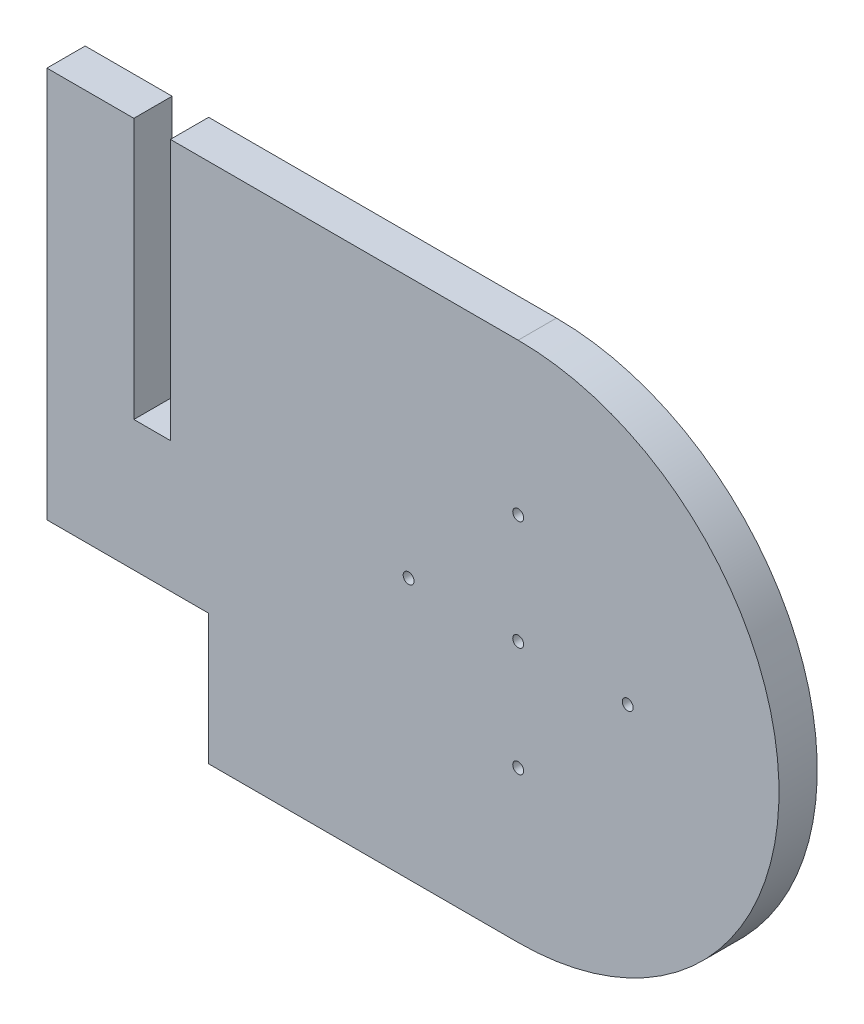
ISO-10303-21;
HEADER;
FILE_DESCRIPTION(('STEP AP214'),'2;1');
FILE_NAME('part.step','',(''),(''),'','','');
FILE_SCHEMA(('AUTOMOTIVE_DESIGN { 1 0 10303 214 1 1 1 1 }'));
ENDSEC;
DATA;
#1=APPLICATION_CONTEXT('core data for automotive mechanical design processes');
#2=APPLICATION_PROTOCOL_DEFINITION('international standard','automotive_design',2000,#1);
#3=PRODUCT_CONTEXT('',#1,'mechanical');
#4=PRODUCT('Part','Part','',(#3));
#5=PRODUCT_RELATED_PRODUCT_CATEGORY('part','',(#4));
#6=PRODUCT_DEFINITION_FORMATION('','',#4);
#7=PRODUCT_DEFINITION_CONTEXT('part definition',#1,'design');
#8=PRODUCT_DEFINITION('design','',#6,#7);
#9=PRODUCT_DEFINITION_SHAPE('','',#8);
#10=(LENGTH_UNIT() NAMED_UNIT(*) SI_UNIT(.MILLI.,.METRE.));
#11=(NAMED_UNIT(*) PLANE_ANGLE_UNIT() SI_UNIT($,.RADIAN.));
#12=(NAMED_UNIT(*) SI_UNIT($,.STERADIAN.) SOLID_ANGLE_UNIT());
#13=UNCERTAINTY_MEASURE_WITH_UNIT(LENGTH_MEASURE(1.E-05),#10,'distance_accuracy_value','');
#14=(GEOMETRIC_REPRESENTATION_CONTEXT(3) GLOBAL_UNCERTAINTY_ASSIGNED_CONTEXT((#13)) GLOBAL_UNIT_ASSIGNED_CONTEXT((#10,
#11,#12)) REPRESENTATION_CONTEXT('',''));
#15=CARTESIAN_POINT('',(0.,0.,0.));
#16=DIRECTION('',(0.,0.,1.));
#17=DIRECTION('',(1.,0.,0.));
#18=AXIS2_PLACEMENT_3D('',#15,#16,#17);
#19=CARTESIAN_POINT('',(18.6719276179453,0.,2.794));
#20=DIRECTION('',(0.,0.,1.));
#21=DIRECTION('',(1.,0.,0.));
#22=AXIS2_PLACEMENT_3D('',#19,#20,#21);
#23=PLANE('',#22);
#24=CARTESIAN_POINT('',(18.6719276179453,-8.,2.794));
#25=DIRECTION('',(0.,0.,1.));
#26=DIRECTION('',(1.,0.,0.));
#27=AXIS2_PLACEMENT_3D('',#24,#25,#26);
#28=CIRCLE('',#27,0.396875);
#29=CARTESIAN_POINT('',(19.0688026179453,-8.,2.794));
#30=VERTEX_POINT('',#29);
#31=EDGE_CURVE('E224',#30,#30,#28,.T.);
#32=ORIENTED_EDGE('',*,*,#31,.F.);
#33=EDGE_LOOP('',(#32));
#34=FACE_BOUND('',#33,.T.);
#35=CARTESIAN_POINT('',(18.6719276179453,0.,2.794));
#36=DIRECTION('',(0.,0.,1.));
#37=DIRECTION('',(1.,0.,0.));
#38=AXIS2_PLACEMENT_3D('',#35,#36,#37);
#39=CIRCLE('',#38,0.396875);
#40=CARTESIAN_POINT('',(19.0688026179453,0.,2.794));
#41=VERTEX_POINT('',#40);
#42=EDGE_CURVE('E212',#41,#41,#39,.T.);
#43=ORIENTED_EDGE('',*,*,#42,.F.);
#44=EDGE_LOOP('',(#43));
#45=FACE_BOUND('',#44,.T.);
#46=CARTESIAN_POINT('',(18.6719276179453,0.,2.794));
#47=DIRECTION('',(0.,0.,1.));
#48=DIRECTION('',(1.,0.,0.));
#49=AXIS2_PLACEMENT_3D('',#46,#47,#48);
#50=CIRCLE('',#49,19.05);
#51=CARTESIAN_POINT('',(18.6719276179453,-19.05,2.794));
#52=VERTEX_POINT('',#51);
#53=CARTESIAN_POINT('',(18.6719276179453,19.05,2.794));
#54=VERTEX_POINT('',#53);
#55=EDGE_CURVE('E161',#52,#54,#50,.T.);
#56=ORIENTED_EDGE('',*,*,#55,.T.);
#57=DIRECTION('',(-1.,0.,0.));
#58=VECTOR('',#57,1.);
#59=CARTESIAN_POINT('',(-6.72807238205472,19.05,2.794));
#60=LINE('',#59,#58);
#61=CARTESIAN_POINT('',(-6.72807238205472,19.05,2.794));
#62=VERTEX_POINT('',#61);
#63=EDGE_CURVE('E99',#54,#62,#60,.T.);
#64=ORIENTED_EDGE('',*,*,#63,.T.);
#65=DIRECTION('',(0.,-1.,0.));
#66=VECTOR('',#65,1.);
#67=CARTESIAN_POINT('',(-6.72807238205472,19.05,2.794));
#68=LINE('',#67,#66);
#69=CARTESIAN_POINT('',(-6.72807238205472,0.,2.794));
#70=VERTEX_POINT('',#69);
#71=EDGE_CURVE('E182',#62,#70,#68,.T.);
#72=ORIENTED_EDGE('',*,*,#71,.T.);
#73=DIRECTION('',(-1.,0.,0.));
#74=VECTOR('',#73,1.);
#75=CARTESIAN_POINT('',(-9.39507238205474,0.,2.794));
#76=LINE('',#75,#74);
#77=CARTESIAN_POINT('',(-9.39507238205474,0.,2.794));
#78=VERTEX_POINT('',#77);
#79=EDGE_CURVE('E201',#70,#78,#76,.T.);
#80=ORIENTED_EDGE('',*,*,#79,.T.);
#81=DIRECTION('',(0.,1.,0.));
#82=VECTOR('',#81,1.);
#83=CARTESIAN_POINT('',(-9.39507238205474,19.05,2.794));
#84=LINE('',#83,#82);
#85=CARTESIAN_POINT('',(-9.39507238205474,19.05,2.794));
#86=VERTEX_POINT('',#85);
#87=EDGE_CURVE('E198',#78,#86,#84,.T.);
#88=ORIENTED_EDGE('',*,*,#87,.T.);
#89=DIRECTION('',(-1.,0.,0.));
#90=VECTOR('',#89,1.);
#91=CARTESIAN_POINT('',(-15.7450723820547,19.05,2.794));
#92=LINE('',#91,#90);
#93=CARTESIAN_POINT('',(-15.7450723820547,19.05,2.794));
#94=VERTEX_POINT('',#93);
#95=EDGE_CURVE('E200',#86,#94,#92,.T.);
#96=ORIENTED_EDGE('',*,*,#95,.T.);
#97=DIRECTION('',(0.,-1.,0.));
#98=VECTOR('',#97,1.);
#99=CARTESIAN_POINT('',(-15.7450723820547,-9.525,2.794));
#100=LINE('',#99,#98);
#101=CARTESIAN_POINT('',(-15.7450723820547,-9.525,2.794));
#102=VERTEX_POINT('',#101);
#103=EDGE_CURVE('E124',#94,#102,#100,.T.);
#104=ORIENTED_EDGE('',*,*,#103,.T.);
#105=DIRECTION('',(1.,0.,0.));
#106=VECTOR('',#105,1.);
#107=CARTESIAN_POINT('',(-3.93407238205472,-9.52499999999999,2.794));
#108=LINE('',#107,#106);
#109=CARTESIAN_POINT('',(-3.93407238205472,-9.52499999999999,2.794));
#110=VERTEX_POINT('',#109);
#111=EDGE_CURVE('E118',#102,#110,#108,.T.);
#112=ORIENTED_EDGE('',*,*,#111,.T.);
#113=DIRECTION('',(0.,-1.,0.));
#114=VECTOR('',#113,1.);
#115=CARTESIAN_POINT('',(-3.93407238205472,-9.52499999999999,2.794));
#116=LINE('',#115,#114);
#117=CARTESIAN_POINT('',(-3.93407238205472,-19.05,2.794));
#118=VERTEX_POINT('',#117);
#119=EDGE_CURVE('E122',#110,#118,#116,.T.);
#120=ORIENTED_EDGE('',*,*,#119,.T.);
#121=DIRECTION('',(1.,0.,0.));
#122=VECTOR('',#121,1.);
#123=CARTESIAN_POINT('',(-3.93407238205472,-19.05,2.794));
#124=LINE('',#123,#122);
#125=EDGE_CURVE('E50',#118,#52,#124,.T.);
#126=ORIENTED_EDGE('',*,*,#125,.T.);
#127=EDGE_LOOP('',(#56,#64,#72,#80,#88,#96,#104,#112,#120,#126));
#128=FACE_BOUND('',#127,.T.);
#129=CARTESIAN_POINT('',(18.6719276179453,8.,2.794));
#130=DIRECTION('',(0.,0.,1.));
#131=DIRECTION('',(1.,0.,0.));
#132=AXIS2_PLACEMENT_3D('',#129,#130,#131);
#133=CIRCLE('',#132,0.396875);
#134=CARTESIAN_POINT('',(19.0688026179453,8.,2.794));
#135=VERTEX_POINT('',#134);
#136=EDGE_CURVE('E146',#135,#135,#133,.T.);
#137=ORIENTED_EDGE('',*,*,#136,.F.);
#138=EDGE_LOOP('',(#137));
#139=FACE_BOUND('',#138,.T.);
#140=CARTESIAN_POINT('',(26.6719276179453,0.,2.794));
#141=DIRECTION('',(0.,0.,1.));
#142=DIRECTION('',(1.,0.,0.));
#143=AXIS2_PLACEMENT_3D('',#140,#141,#142);
#144=CIRCLE('',#143,0.396875);
#145=CARTESIAN_POINT('',(27.0688026179453,0.,2.794));
#146=VERTEX_POINT('',#145);
#147=EDGE_CURVE('E218',#146,#146,#144,.T.);
#148=ORIENTED_EDGE('',*,*,#147,.F.);
#149=EDGE_LOOP('',(#148));
#150=FACE_BOUND('',#149,.T.);
#151=CARTESIAN_POINT('',(10.6719276179453,0.,2.794));
#152=DIRECTION('',(0.,0.,1.));
#153=DIRECTION('',(1.,0.,0.));
#154=AXIS2_PLACEMENT_3D('',#151,#152,#153);
#155=CIRCLE('',#154,0.396875);
#156=CARTESIAN_POINT('',(11.0688026179453,0.,2.794));
#157=VERTEX_POINT('',#156);
#158=EDGE_CURVE('E230',#157,#157,#155,.T.);
#159=ORIENTED_EDGE('',*,*,#158,.F.);
#160=EDGE_LOOP('',(#159));
#161=FACE_BOUND('',#160,.T.);
#162=ADVANCED_FACE('F33',(#34,#45,#128,#139,#150,#161),#23,.T.);
#163=CARTESIAN_POINT('',(18.6719276179453,0.,0.));
#164=DIRECTION('',(0.,0.,1.));
#165=DIRECTION('',(1.,0.,0.));
#166=AXIS2_PLACEMENT_3D('',#163,#164,#165);
#167=PLANE('',#166);
#168=CARTESIAN_POINT('',(18.6719276179453,-8.,0.));
#169=DIRECTION('',(0.,0.,1.));
#170=DIRECTION('',(1.,0.,0.));
#171=AXIS2_PLACEMENT_3D('',#168,#169,#170);
#172=CIRCLE('',#171,0.396875);
#173=CARTESIAN_POINT('',(19.0688026179453,-8.,0.));
#174=VERTEX_POINT('',#173);
#175=EDGE_CURVE('E227',#174,#174,#172,.T.);
#176=ORIENTED_EDGE('',*,*,#175,.T.);
#177=EDGE_LOOP('',(#176));
#178=FACE_BOUND('',#177,.T.);
#179=CARTESIAN_POINT('',(18.6719276179453,0.,0.));
#180=DIRECTION('',(0.,0.,1.));
#181=DIRECTION('',(1.,0.,0.));
#182=AXIS2_PLACEMENT_3D('',#179,#180,#181);
#183=CIRCLE('',#182,0.396875);
#184=CARTESIAN_POINT('',(19.0688026179453,0.,0.));
#185=VERTEX_POINT('',#184);
#186=EDGE_CURVE('E215',#185,#185,#183,.T.);
#187=ORIENTED_EDGE('',*,*,#186,.T.);
#188=EDGE_LOOP('',(#187));
#189=FACE_BOUND('',#188,.T.);
#190=CARTESIAN_POINT('',(18.6719276179453,0.,0.));
#191=DIRECTION('',(0.,0.,1.));
#192=DIRECTION('',(1.,0.,0.));
#193=AXIS2_PLACEMENT_3D('',#190,#191,#192);
#194=CIRCLE('',#193,19.05);
#195=CARTESIAN_POINT('',(18.6719276179453,-19.05,0.));
#196=VERTEX_POINT('',#195);
#197=CARTESIAN_POINT('',(18.6719276179453,19.05,0.));
#198=VERTEX_POINT('',#197);
#199=EDGE_CURVE('E142',#196,#198,#194,.T.);
#200=ORIENTED_EDGE('',*,*,#199,.F.);
#201=DIRECTION('',(1.,0.,0.));
#202=VECTOR('',#201,1.);
#203=CARTESIAN_POINT('',(-3.93407238205472,-19.05,0.));
#204=LINE('',#203,#202);
#205=CARTESIAN_POINT('',(-3.93407238205472,-19.05,0.));
#206=VERTEX_POINT('',#205);
#207=EDGE_CURVE('E91',#206,#196,#204,.T.);
#208=ORIENTED_EDGE('',*,*,#207,.F.);
#209=DIRECTION('',(0.,-1.,0.));
#210=VECTOR('',#209,1.);
#211=CARTESIAN_POINT('',(-3.93407238205472,-9.52499999999999,0.));
#212=LINE('',#211,#210);
#213=CARTESIAN_POINT('',(-3.93407238205472,-9.52499999999999,0.));
#214=VERTEX_POINT('',#213);
#215=EDGE_CURVE('E85',#214,#206,#212,.T.);
#216=ORIENTED_EDGE('',*,*,#215,.F.);
#217=DIRECTION('',(1.,0.,0.));
#218=VECTOR('',#217,1.);
#219=CARTESIAN_POINT('',(-3.93407238205472,-9.52499999999999,0.));
#220=LINE('',#219,#218);
#221=CARTESIAN_POINT('',(-15.7450723820547,-9.525,0.));
#222=VERTEX_POINT('',#221);
#223=EDGE_CURVE('E132',#222,#214,#220,.T.);
#224=ORIENTED_EDGE('',*,*,#223,.F.);
#225=DIRECTION('',(0.,-1.,0.));
#226=VECTOR('',#225,1.);
#227=CARTESIAN_POINT('',(-15.7450723820547,-9.525,0.));
#228=LINE('',#227,#226);
#229=CARTESIAN_POINT('',(-15.7450723820547,19.05,0.));
#230=VERTEX_POINT('',#229);
#231=EDGE_CURVE('E156',#230,#222,#228,.T.);
#232=ORIENTED_EDGE('',*,*,#231,.F.);
#233=DIRECTION('',(-1.,0.,0.));
#234=VECTOR('',#233,1.);
#235=CARTESIAN_POINT('',(-15.7450723820547,19.05,0.));
#236=LINE('',#235,#234);
#237=CARTESIAN_POINT('',(-9.39507238205474,19.05,0.));
#238=VERTEX_POINT('',#237);
#239=EDGE_CURVE('E154',#238,#230,#236,.T.);
#240=ORIENTED_EDGE('',*,*,#239,.F.);
#241=DIRECTION('',(0.,1.,0.));
#242=VECTOR('',#241,1.);
#243=CARTESIAN_POINT('',(-9.39507238205474,19.05,0.));
#244=LINE('',#243,#242);
#245=CARTESIAN_POINT('',(-9.39507238205474,0.,0.));
#246=VERTEX_POINT('',#245);
#247=EDGE_CURVE('E152',#246,#238,#244,.T.);
#248=ORIENTED_EDGE('',*,*,#247,.F.);
#249=DIRECTION('',(-1.,0.,0.));
#250=VECTOR('',#249,1.);
#251=CARTESIAN_POINT('',(-9.39507238205474,0.,0.));
#252=LINE('',#251,#250);
#253=CARTESIAN_POINT('',(-6.72807238205472,0.,0.));
#254=VERTEX_POINT('',#253);
#255=EDGE_CURVE('E150',#254,#246,#252,.T.);
#256=ORIENTED_EDGE('',*,*,#255,.F.);
#257=DIRECTION('',(0.,-1.,0.));
#258=VECTOR('',#257,1.);
#259=CARTESIAN_POINT('',(-6.72807238205472,19.05,0.));
#260=LINE('',#259,#258);
#261=CARTESIAN_POINT('',(-6.72807238205472,19.05,0.));
#262=VERTEX_POINT('',#261);
#263=EDGE_CURVE('E148',#262,#254,#260,.T.);
#264=ORIENTED_EDGE('',*,*,#263,.F.);
#265=DIRECTION('',(-1.,0.,0.));
#266=VECTOR('',#265,1.);
#267=CARTESIAN_POINT('',(-6.72807238205472,19.05,0.));
#268=LINE('',#267,#266);
#269=EDGE_CURVE('E145',#198,#262,#268,.T.);
#270=ORIENTED_EDGE('',*,*,#269,.F.);
#271=EDGE_LOOP('',(#200,#208,#216,#224,#232,#240,#248,#256,#264,#270));
#272=FACE_BOUND('',#271,.T.);
#273=CARTESIAN_POINT('',(18.6719276179453,8.,0.));
#274=DIRECTION('',(0.,0.,1.));
#275=DIRECTION('',(1.,0.,0.));
#276=AXIS2_PLACEMENT_3D('',#273,#274,#275);
#277=CIRCLE('',#276,0.396875);
#278=CARTESIAN_POINT('',(19.0688026179453,8.,0.));
#279=VERTEX_POINT('',#278);
#280=EDGE_CURVE('E209',#279,#279,#277,.T.);
#281=ORIENTED_EDGE('',*,*,#280,.T.);
#282=EDGE_LOOP('',(#281));
#283=FACE_BOUND('',#282,.T.);
#284=CARTESIAN_POINT('',(26.6719276179453,0.,0.));
#285=DIRECTION('',(0.,0.,1.));
#286=DIRECTION('',(1.,0.,0.));
#287=AXIS2_PLACEMENT_3D('',#284,#285,#286);
#288=CIRCLE('',#287,0.396875);
#289=CARTESIAN_POINT('',(27.0688026179453,0.,0.));
#290=VERTEX_POINT('',#289);
#291=EDGE_CURVE('E221',#290,#290,#288,.T.);
#292=ORIENTED_EDGE('',*,*,#291,.T.);
#293=EDGE_LOOP('',(#292));
#294=FACE_BOUND('',#293,.T.);
#295=CARTESIAN_POINT('',(10.6719276179453,0.,0.));
#296=DIRECTION('',(0.,0.,1.));
#297=DIRECTION('',(1.,0.,0.));
#298=AXIS2_PLACEMENT_3D('',#295,#296,#297);
#299=CIRCLE('',#298,0.396875);
#300=CARTESIAN_POINT('',(11.0688026179453,0.,0.));
#301=VERTEX_POINT('',#300);
#302=EDGE_CURVE('E233',#301,#301,#299,.T.);
#303=ORIENTED_EDGE('',*,*,#302,.T.);
#304=EDGE_LOOP('',(#303));
#305=FACE_BOUND('',#304,.T.);
#306=ADVANCED_FACE('F186',(#178,#189,#272,#283,#294,#305),#167,.F.);
#307=CARTESIAN_POINT('',(18.6719276179453,0.,2.794));
#308=DIRECTION('',(0.,0.,-1.));
#309=DIRECTION('',(-1.,0.,0.));
#310=AXIS2_PLACEMENT_3D('',#307,#308,#309);
#311=CYLINDRICAL_SURFACE('',#310,19.05);
#312=ORIENTED_EDGE('',*,*,#199,.T.);
#313=DIRECTION('',(0.,0.,-1.));
#314=VECTOR('',#313,1.);
#315=CARTESIAN_POINT('',(18.6719276179453,19.05,2.794));
#316=LINE('',#315,#314);
#317=EDGE_CURVE('E11',#54,#198,#316,.T.);
#318=ORIENTED_EDGE('',*,*,#317,.F.);
#319=ORIENTED_EDGE('',*,*,#55,.F.);
#320=DIRECTION('',(0.,0.,-1.));
#321=VECTOR('',#320,1.);
#322=CARTESIAN_POINT('',(18.6719276179453,-19.05,2.794));
#323=LINE('',#322,#321);
#324=EDGE_CURVE('E138',#52,#196,#323,.T.);
#325=ORIENTED_EDGE('',*,*,#324,.T.);
#326=EDGE_LOOP('',(#312,#318,#319,#325));
#327=FACE_BOUND('',#326,.T.);
#328=ADVANCED_FACE('F35',(#327),#311,.T.);
#329=CARTESIAN_POINT('',(-6.72807238205472,19.05,2.794));
#330=DIRECTION('',(0.,-1.,0.));
#331=DIRECTION('',(0.,0.,-1.));
#332=AXIS2_PLACEMENT_3D('',#329,#330,#331);
#333=PLANE('',#332);
#334=ORIENTED_EDGE('',*,*,#269,.T.);
#335=DIRECTION('',(0.,0.,-1.));
#336=VECTOR('',#335,1.);
#337=CARTESIAN_POINT('',(-6.72807238205472,19.05,2.794));
#338=LINE('',#337,#336);
#339=EDGE_CURVE('E42',#62,#262,#338,.T.);
#340=ORIENTED_EDGE('',*,*,#339,.F.);
#341=ORIENTED_EDGE('',*,*,#63,.F.);
#342=ORIENTED_EDGE('',*,*,#317,.T.);
#343=EDGE_LOOP('',(#334,#340,#341,#342));
#344=FACE_BOUND('',#343,.T.);
#345=ADVANCED_FACE('F276',(#344),#333,.F.);
#346=CARTESIAN_POINT('',(-6.72807238205472,19.05,2.794));
#347=DIRECTION('',(1.,0.,0.));
#348=DIRECTION('',(0.,1.,0.));
#349=AXIS2_PLACEMENT_3D('',#346,#347,#348);
#350=PLANE('',#349);
#351=ORIENTED_EDGE('',*,*,#263,.T.);
#352=DIRECTION('',(0.,0.,-1.));
#353=VECTOR('',#352,1.);
#354=CARTESIAN_POINT('',(-6.72807238205472,0.,2.794));
#355=LINE('',#354,#353);
#356=EDGE_CURVE('E174',#70,#254,#355,.T.);
#357=ORIENTED_EDGE('',*,*,#356,.F.);
#358=ORIENTED_EDGE('',*,*,#71,.F.);
#359=ORIENTED_EDGE('',*,*,#339,.T.);
#360=EDGE_LOOP('',(#351,#357,#358,#359));
#361=FACE_BOUND('',#360,.T.);
#362=ADVANCED_FACE('F180',(#361),#350,.F.);
#363=CARTESIAN_POINT('',(-9.39507238205474,0.,2.794));
#364=DIRECTION('',(0.,-1.,0.));
#365=DIRECTION('',(1.,0.,0.));
#366=AXIS2_PLACEMENT_3D('',#363,#364,#365);
#367=PLANE('',#366);
#368=ORIENTED_EDGE('',*,*,#255,.T.);
#369=DIRECTION('',(0.,0.,-1.));
#370=VECTOR('',#369,1.);
#371=CARTESIAN_POINT('',(-9.39507238205474,0.,2.794));
#372=LINE('',#371,#370);
#373=EDGE_CURVE('E171',#78,#246,#372,.T.);
#374=ORIENTED_EDGE('',*,*,#373,.F.);
#375=ORIENTED_EDGE('',*,*,#79,.F.);
#376=ORIENTED_EDGE('',*,*,#356,.T.);
#377=EDGE_LOOP('',(#368,#374,#375,#376));
#378=FACE_BOUND('',#377,.T.);
#379=ADVANCED_FACE('F192',(#378),#367,.F.);
#380=CARTESIAN_POINT('',(-9.39507238205474,19.05,2.794));
#381=DIRECTION('',(-1.,0.,0.));
#382=DIRECTION('',(0.,-1.,0.));
#383=AXIS2_PLACEMENT_3D('',#380,#381,#382);
#384=PLANE('',#383);
#385=ORIENTED_EDGE('',*,*,#247,.T.);
#386=DIRECTION('',(0.,0.,-1.));
#387=VECTOR('',#386,1.);
#388=CARTESIAN_POINT('',(-9.39507238205474,19.05,2.794));
#389=LINE('',#388,#387);
#390=EDGE_CURVE('E168',#86,#238,#389,.T.);
#391=ORIENTED_EDGE('',*,*,#390,.F.);
#392=ORIENTED_EDGE('',*,*,#87,.F.);
#393=ORIENTED_EDGE('',*,*,#373,.T.);
#394=EDGE_LOOP('',(#385,#391,#392,#393));
#395=FACE_BOUND('',#394,.T.);
#396=ADVANCED_FACE('F196',(#395),#384,.F.);
#397=CARTESIAN_POINT('',(-15.7450723820547,19.05,2.794));
#398=DIRECTION('',(0.,-1.,0.));
#399=DIRECTION('',(0.,0.,-1.));
#400=AXIS2_PLACEMENT_3D('',#397,#398,#399);
#401=PLANE('',#400);
#402=ORIENTED_EDGE('',*,*,#239,.T.);
#403=DIRECTION('',(0.,0.,-1.));
#404=VECTOR('',#403,1.);
#405=CARTESIAN_POINT('',(-15.7450723820547,19.05,2.794));
#406=LINE('',#405,#404);
#407=EDGE_CURVE('E165',#94,#230,#406,.T.);
#408=ORIENTED_EDGE('',*,*,#407,.F.);
#409=ORIENTED_EDGE('',*,*,#95,.F.);
#410=ORIENTED_EDGE('',*,*,#390,.T.);
#411=EDGE_LOOP('',(#402,#408,#409,#410));
#412=FACE_BOUND('',#411,.T.);
#413=ADVANCED_FACE('F266',(#412),#401,.F.);
#414=CARTESIAN_POINT('',(-15.7450723820547,-9.525,2.794));
#415=DIRECTION('',(1.,0.,0.));
#416=DIRECTION('',(0.,1.,0.));
#417=AXIS2_PLACEMENT_3D('',#414,#415,#416);
#418=PLANE('',#417);
#419=ORIENTED_EDGE('',*,*,#231,.T.);
#420=DIRECTION('',(0.,0.,-1.));
#421=VECTOR('',#420,1.);
#422=CARTESIAN_POINT('',(-15.7450723820547,-9.525,2.794));
#423=LINE('',#422,#421);
#424=EDGE_CURVE('E133',#102,#222,#423,.T.);
#425=ORIENTED_EDGE('',*,*,#424,.F.);
#426=ORIENTED_EDGE('',*,*,#103,.F.);
#427=ORIENTED_EDGE('',*,*,#407,.T.);
#428=EDGE_LOOP('',(#419,#425,#426,#427));
#429=FACE_BOUND('',#428,.T.);
#430=ADVANCED_FACE('F263',(#429),#418,.F.);
#431=CARTESIAN_POINT('',(-3.93407238205472,-9.52499999999999,2.794));
#432=DIRECTION('',(0.,1.,0.));
#433=DIRECTION('',(-1.,0.,0.));
#434=AXIS2_PLACEMENT_3D('',#431,#432,#433);
#435=PLANE('',#434);
#436=ORIENTED_EDGE('',*,*,#223,.T.);
#437=DIRECTION('',(0.,0.,-1.));
#438=VECTOR('',#437,1.);
#439=CARTESIAN_POINT('',(-3.93407238205472,-9.52499999999999,2.794));
#440=LINE('',#439,#438);
#441=EDGE_CURVE('E129',#110,#214,#440,.T.);
#442=ORIENTED_EDGE('',*,*,#441,.F.);
#443=ORIENTED_EDGE('',*,*,#111,.F.);
#444=ORIENTED_EDGE('',*,*,#424,.T.);
#445=EDGE_LOOP('',(#436,#442,#443,#444));
#446=FACE_BOUND('',#445,.T.);
#447=ADVANCED_FACE('F130',(#446),#435,.F.);
#448=CARTESIAN_POINT('',(-3.93407238205472,-9.52499999999999,2.794));
#449=DIRECTION('',(1.,0.,0.));
#450=DIRECTION('',(0.,1.,0.));
#451=AXIS2_PLACEMENT_3D('',#448,#449,#450);
#452=PLANE('',#451);
#453=ORIENTED_EDGE('',*,*,#215,.T.);
#454=DIRECTION('',(0.,0.,-1.));
#455=VECTOR('',#454,1.);
#456=CARTESIAN_POINT('',(-3.93407238205472,-19.05,2.794));
#457=LINE('',#456,#455);
#458=EDGE_CURVE('E134',#118,#206,#457,.T.);
#459=ORIENTED_EDGE('',*,*,#458,.F.);
#460=ORIENTED_EDGE('',*,*,#119,.F.);
#461=ORIENTED_EDGE('',*,*,#441,.T.);
#462=EDGE_LOOP('',(#453,#459,#460,#461));
#463=FACE_BOUND('',#462,.T.);
#464=ADVANCED_FACE('F136',(#463),#452,.F.);
#465=CARTESIAN_POINT('',(-3.93407238205472,-19.05,2.794));
#466=DIRECTION('',(0.,1.,0.));
#467=DIRECTION('',(0.,0.,1.));
#468=AXIS2_PLACEMENT_3D('',#465,#466,#467);
#469=PLANE('',#468);
#470=ORIENTED_EDGE('',*,*,#207,.T.);
#471=ORIENTED_EDGE('',*,*,#324,.F.);
#472=ORIENTED_EDGE('',*,*,#125,.F.);
#473=ORIENTED_EDGE('',*,*,#458,.T.);
#474=EDGE_LOOP('',(#470,#471,#472,#473));
#475=FACE_BOUND('',#474,.T.);
#476=ADVANCED_FACE('F256',(#475),#469,.F.);
#477=CARTESIAN_POINT('',(18.6719276179453,8.,2.794));
#478=DIRECTION('',(0.,0.,-1.));
#479=DIRECTION('',(-1.,0.,0.));
#480=AXIS2_PLACEMENT_3D('',#477,#478,#479);
#481=CYLINDRICAL_SURFACE('',#480,0.396875);
#482=ORIENTED_EDGE('',*,*,#136,.T.);
#483=EDGE_LOOP('',(#482));
#484=FACE_BOUND('',#483,.T.);
#485=ORIENTED_EDGE('',*,*,#280,.F.);
#486=EDGE_LOOP('',(#485));
#487=FACE_BOUND('',#486,.T.);
#488=ADVANCED_FACE('F253',(#484,#487),#481,.F.);
#489=CARTESIAN_POINT('',(18.6719276179453,0.,2.794));
#490=DIRECTION('',(0.,0.,-1.));
#491=DIRECTION('',(-1.,0.,0.));
#492=AXIS2_PLACEMENT_3D('',#489,#490,#491);
#493=CYLINDRICAL_SURFACE('',#492,0.396875);
#494=ORIENTED_EDGE('',*,*,#42,.T.);
#495=EDGE_LOOP('',(#494));
#496=FACE_BOUND('',#495,.T.);
#497=ORIENTED_EDGE('',*,*,#186,.F.);
#498=EDGE_LOOP('',(#497));
#499=FACE_BOUND('',#498,.T.);
#500=ADVANCED_FACE('F352',(#496,#499),#493,.F.);
#501=CARTESIAN_POINT('',(26.6719276179453,0.,2.794));
#502=DIRECTION('',(0.,0.,-1.));
#503=DIRECTION('',(-1.,0.,0.));
#504=AXIS2_PLACEMENT_3D('',#501,#502,#503);
#505=CYLINDRICAL_SURFACE('',#504,0.396875);
#506=ORIENTED_EDGE('',*,*,#147,.T.);
#507=EDGE_LOOP('',(#506));
#508=FACE_BOUND('',#507,.T.);
#509=ORIENTED_EDGE('',*,*,#291,.F.);
#510=EDGE_LOOP('',(#509));
#511=FACE_BOUND('',#510,.T.);
#512=ADVANCED_FACE('F360',(#508,#511),#505,.F.);
#513=CARTESIAN_POINT('',(18.6719276179453,-8.,2.794));
#514=DIRECTION('',(0.,0.,-1.));
#515=DIRECTION('',(-1.,0.,0.));
#516=AXIS2_PLACEMENT_3D('',#513,#514,#515);
#517=CYLINDRICAL_SURFACE('',#516,0.396875);
#518=ORIENTED_EDGE('',*,*,#31,.T.);
#519=EDGE_LOOP('',(#518));
#520=FACE_BOUND('',#519,.T.);
#521=ORIENTED_EDGE('',*,*,#175,.F.);
#522=EDGE_LOOP('',(#521));
#523=FACE_BOUND('',#522,.T.);
#524=ADVANCED_FACE('F368',(#520,#523),#517,.F.);
#525=CARTESIAN_POINT('',(10.6719276179453,0.,2.794));
#526=DIRECTION('',(0.,0.,-1.));
#527=DIRECTION('',(-1.,0.,0.));
#528=AXIS2_PLACEMENT_3D('',#525,#526,#527);
#529=CYLINDRICAL_SURFACE('',#528,0.396875);
#530=ORIENTED_EDGE('',*,*,#158,.T.);
#531=EDGE_LOOP('',(#530));
#532=FACE_BOUND('',#531,.T.);
#533=ORIENTED_EDGE('',*,*,#302,.F.);
#534=EDGE_LOOP('',(#533));
#535=FACE_BOUND('',#534,.T.);
#536=ADVANCED_FACE('F239',(#532,#535),#529,.F.);
#537=CLOSED_SHELL('',(#162,#306,#328,#345,#362,#379,#396,#413,#430,#447,#464,#476,#488,#500,
#512,#524,#536));
#538=MANIFOLD_SOLID_BREP('B2',#537);
#539=ADVANCED_BREP_SHAPE_REPRESENTATION('',(#18,#538),#14);
#540=SHAPE_DEFINITION_REPRESENTATION(#9,#539);
ENDSEC;
END-ISO-10303-21;
